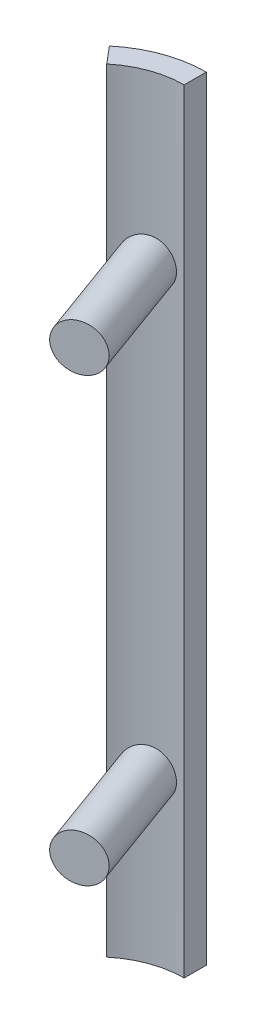
ISO-10303-21;
HEADER;
FILE_DESCRIPTION(('STEP AP214'),'2;1');
FILE_NAME('part.step','',(''),(''),'','','');
FILE_SCHEMA(('AUTOMOTIVE_DESIGN { 1 0 10303 214 1 1 1 1 }'));
ENDSEC;
DATA;
#1=APPLICATION_CONTEXT('core data for automotive mechanical design processes');
#2=APPLICATION_PROTOCOL_DEFINITION('international standard','automotive_design',2000,#1);
#3=PRODUCT_CONTEXT('',#1,'mechanical');
#4=PRODUCT('Part','Part','',(#3));
#5=PRODUCT_RELATED_PRODUCT_CATEGORY('part','',(#4));
#6=PRODUCT_DEFINITION_FORMATION('','',#4);
#7=PRODUCT_DEFINITION_CONTEXT('part definition',#1,'design');
#8=PRODUCT_DEFINITION('design','',#6,#7);
#9=PRODUCT_DEFINITION_SHAPE('','',#8);
#10=(LENGTH_UNIT() NAMED_UNIT(*) SI_UNIT(.MILLI.,.METRE.));
#11=(NAMED_UNIT(*) PLANE_ANGLE_UNIT() SI_UNIT($,.RADIAN.));
#12=(NAMED_UNIT(*) SI_UNIT($,.STERADIAN.) SOLID_ANGLE_UNIT());
#13=UNCERTAINTY_MEASURE_WITH_UNIT(LENGTH_MEASURE(1.E-05),#10,'distance_accuracy_value','');
#14=(GEOMETRIC_REPRESENTATION_CONTEXT(3) GLOBAL_UNCERTAINTY_ASSIGNED_CONTEXT((#13)) GLOBAL_UNIT_ASSIGNED_CONTEXT((#10,
#11,#12)) REPRESENTATION_CONTEXT('',''));
#15=CARTESIAN_POINT('',(0.,0.,0.));
#16=DIRECTION('',(0.,0.,1.));
#17=DIRECTION('',(1.,0.,0.));
#18=AXIS2_PLACEMENT_3D('',#15,#16,#17);
#19=CARTESIAN_POINT('',(0.,0.,0.));
#20=DIRECTION('',(0.,-1.,0.));
#21=DIRECTION('',(0.,0.,-1.));
#22=AXIS2_PLACEMENT_3D('',#19,#20,#21);
#23=PLANE('',#22);
#24=CARTESIAN_POINT('',(0.,0.,0.));
#25=DIRECTION('',(0.,1.,0.));
#26=DIRECTION('',(0.,0.,-1.));
#27=AXIS2_PLACEMENT_3D('',#24,#25,#26);
#28=CIRCLE('',#27,8.);
#29=CARTESIAN_POINT('',(0.,0.,-8.));
#30=VERTEX_POINT('',#29);
#31=CARTESIAN_POINT('',(-5.14230087749233,0.,-6.12835554495182));
#32=VERTEX_POINT('',#31);
#33=EDGE_CURVE('E54',#30,#32,#28,.T.);
#34=ORIENTED_EDGE('',*,*,#33,.T.);
#35=DIRECTION('',(-0.64278760968654,0.,-0.766044443118977));
#36=VECTOR('',#35,1.);
#37=CARTESIAN_POINT('',(0.,0.,0.));
#38=LINE('',#37,#36);
#39=CARTESIAN_POINT('',(-6.42787609686541,0.,-7.66044443118977));
#40=VERTEX_POINT('',#39);
#41=EDGE_CURVE('E90',#32,#40,#38,.T.);
#42=ORIENTED_EDGE('',*,*,#41,.T.);
#43=CARTESIAN_POINT('',(0.,0.,0.));
#44=DIRECTION('',(0.,-1.,0.));
#45=DIRECTION('',(0.,0.,-1.));
#46=AXIS2_PLACEMENT_3D('',#43,#44,#45);
#47=CIRCLE('',#46,10.);
#48=CARTESIAN_POINT('',(0.,0.,-10.));
#49=VERTEX_POINT('',#48);
#50=EDGE_CURVE('E11',#40,#49,#47,.T.);
#51=ORIENTED_EDGE('',*,*,#50,.T.);
#52=DIRECTION('',(0.,0.,-1.));
#53=VECTOR('',#52,1.);
#54=CARTESIAN_POINT('',(0.,0.,0.));
#55=LINE('',#54,#53);
#56=EDGE_CURVE('E92',#30,#49,#55,.T.);
#57=ORIENTED_EDGE('',*,*,#56,.F.);
#58=EDGE_LOOP('',(#34,#42,#51,#57));
#59=FACE_BOUND('',#58,.T.);
#60=ADVANCED_FACE('F39',(#59),#23,.T.);
#61=CARTESIAN_POINT('',(0.,0.,0.));
#62=DIRECTION('',(0.,-1.,0.));
#63=DIRECTION('',(0.,0.,-1.));
#64=AXIS2_PLACEMENT_3D('',#61,#62,#63);
#65=CYLINDRICAL_SURFACE('',#64,10.);
#66=CARTESIAN_POINT('',(0.,70.,0.));
#67=DIRECTION('',(0.,-1.,0.));
#68=DIRECTION('',(0.,0.,-1.));
#69=AXIS2_PLACEMENT_3D('',#66,#67,#68);
#70=CIRCLE('',#69,10.);
#71=CARTESIAN_POINT('',(-6.42787609686541,70.,-7.66044443118977));
#72=VERTEX_POINT('',#71);
#73=CARTESIAN_POINT('',(0.,70.,-10.));
#74=VERTEX_POINT('',#73);
#75=EDGE_CURVE('E47',#72,#74,#70,.T.);
#76=ORIENTED_EDGE('',*,*,#75,.T.);
#77=DIRECTION('',(0.,1.,0.));
#78=VECTOR('',#77,1.);
#79=CARTESIAN_POINT('',(0.,0.,-10.));
#80=LINE('',#79,#78);
#81=EDGE_CURVE('E106',#49,#74,#80,.T.);
#82=ORIENTED_EDGE('',*,*,#81,.F.);
#83=ORIENTED_EDGE('',*,*,#50,.F.);
#84=DIRECTION('',(0.,1.,0.));
#85=VECTOR('',#84,1.);
#86=CARTESIAN_POINT('',(-6.42787609686541,0.,-7.66044443118977));
#87=LINE('',#86,#85);
#88=EDGE_CURVE('E97',#40,#72,#87,.T.);
#89=ORIENTED_EDGE('',*,*,#88,.T.);
#90=EDGE_LOOP('',(#76,#82,#83,#89));
#91=FACE_BOUND('',#90,.T.);
#92=ADVANCED_FACE('F115',(#91),#65,.T.);
#93=CARTESIAN_POINT('',(-6.42787609686541,70.0000000000013,-7.66044443118977));
#94=DIRECTION('',(0.,1.,0.));
#95=DIRECTION('',(0.,0.,1.));
#96=AXIS2_PLACEMENT_3D('',#93,#94,#95);
#97=PLANE('',#96);
#98=CARTESIAN_POINT('',(0.,70.0000000000013,0.));
#99=DIRECTION('',(0.,1.,0.));
#100=DIRECTION('',(0.,0.,-1.));
#101=AXIS2_PLACEMENT_3D('',#98,#99,#100);
#102=CIRCLE('',#101,8.);
#103=CARTESIAN_POINT('',(0.,70.0000000000013,-8.));
#104=VERTEX_POINT('',#103);
#105=CARTESIAN_POINT('',(-5.14230087749233,70.0000000000013,-6.12835554495182));
#106=VERTEX_POINT('',#105);
#107=EDGE_CURVE('E81',#104,#106,#102,.T.);
#108=ORIENTED_EDGE('',*,*,#107,.F.);
#109=DIRECTION('',(0.,2.55351295663786E-13,1.));
#110=VECTOR('',#109,1.);
#111=CARTESIAN_POINT('',(0.,70.,-10.));
#112=LINE('',#111,#110);
#113=EDGE_CURVE('E99',#74,#104,#112,.T.);
#114=ORIENTED_EDGE('',*,*,#113,.F.);
#115=ORIENTED_EDGE('',*,*,#75,.F.);
#116=DIRECTION('',(0.64278760968654,2.55351295663786E-13,0.766044443118977));
#117=VECTOR('',#116,1.);
#118=CARTESIAN_POINT('',(-6.42787609686541,70.,-7.66044443118977));
#119=LINE('',#118,#117);
#120=EDGE_CURVE('E103',#72,#106,#119,.T.);
#121=ORIENTED_EDGE('',*,*,#120,.T.);
#122=EDGE_LOOP('',(#108,#114,#115,#121));
#123=FACE_BOUND('',#122,.T.);
#124=ADVANCED_FACE('F119',(#123),#97,.T.);
#125=CARTESIAN_POINT('',(0.,0.,0.));
#126=DIRECTION('',(0.766044443118977,0.,-0.64278760968654));
#127=DIRECTION('',(-0.64278760968654,0.,-0.766044443118977));
#128=AXIS2_PLACEMENT_3D('',#125,#126,#127);
#129=PLANE('',#128);
#130=ORIENTED_EDGE('',*,*,#41,.F.);
#131=DIRECTION('',(0.,1.,0.));
#132=VECTOR('',#131,1.);
#133=CARTESIAN_POINT('',(-5.14230087749233,0.,-6.12835554495182));
#134=LINE('',#133,#132);
#135=EDGE_CURVE('E78',#32,#106,#134,.T.);
#136=ORIENTED_EDGE('',*,*,#135,.T.);
#137=ORIENTED_EDGE('',*,*,#120,.F.);
#138=ORIENTED_EDGE('',*,*,#88,.F.);
#139=EDGE_LOOP('',(#130,#136,#137,#138));
#140=FACE_BOUND('',#139,.T.);
#141=ADVANCED_FACE('F96',(#140),#129,.F.);
#142=CARTESIAN_POINT('',(0.,0.,0.));
#143=DIRECTION('',(1.,0.,0.));
#144=DIRECTION('',(0.,0.,-1.));
#145=AXIS2_PLACEMENT_3D('',#142,#143,#144);
#146=PLANE('',#145);
#147=DIRECTION('',(0.,1.,0.));
#148=VECTOR('',#147,1.);
#149=CARTESIAN_POINT('',(0.,0.,-8.));
#150=LINE('',#149,#148);
#151=EDGE_CURVE('E86',#30,#104,#150,.T.);
#152=ORIENTED_EDGE('',*,*,#151,.F.);
#153=ORIENTED_EDGE('',*,*,#56,.T.);
#154=ORIENTED_EDGE('',*,*,#81,.T.);
#155=ORIENTED_EDGE('',*,*,#113,.T.);
#156=EDGE_LOOP('',(#152,#153,#154,#155));
#157=FACE_BOUND('',#156,.T.);
#158=ADVANCED_FACE('F117',(#157),#146,.T.);
#159=CARTESIAN_POINT('',(0.,0.,0.));
#160=DIRECTION('',(0.,1.,0.));
#161=DIRECTION('',(0.,0.,1.));
#162=AXIS2_PLACEMENT_3D('',#159,#160,#161);
#163=CYLINDRICAL_SURFACE('',#162,8.);
#164=CARTESIAN_POINT('',(-0.666854923131886,15.,-7.97215808369947));
#165=CARTESIAN_POINT('',(-0.666858379185395,15.1157559635556,-7.97215902622908));
#166=CARTESIAN_POINT('',(-0.676779640821833,15.2315432351994,-7.97134686574616));
#167=CARTESIAN_POINT('',(-0.716053157627041,15.4597786680726,-7.96791336746091));
#168=CARTESIAN_POINT('',(-0.745415556814346,15.5722250540692,-7.96529108514078));
#169=CARTESIAN_POINT('',(-0.822321104053135,15.7904441393774,-7.95771748096725));
#170=CARTESIAN_POINT('',(-0.869839225548843,15.8962257928341,-7.95276936298444));
#171=CARTESIAN_POINT('',(-0.981298510244643,16.0985278602645,-7.93978515425553));
#172=CARTESIAN_POINT('',(-1.04524080330709,16.1950476364614,-7.9317488510461));
#173=CARTESIAN_POINT('',(-1.18898376585009,16.3784260029342,-7.9114907940728));
#174=CARTESIAN_POINT('',(-1.26910094581045,16.4650268496506,-7.899181268638));
#175=CARTESIAN_POINT('',(-1.44172477405649,16.6238325986894,-7.86950364534489));
#176=CARTESIAN_POINT('',(-1.53423267214024,16.6960360469778,-7.85213503699094));
#177=CARTESIAN_POINT('',(-1.73034281972777,16.8250670106849,-7.81127930123956));
#178=CARTESIAN_POINT('',(-1.83409470817184,16.8816390630944,-7.78770157640028));
#179=CARTESIAN_POINT('',(-2.04822819368542,16.9761366058962,-7.73414009574326));
#180=CARTESIAN_POINT('',(-2.15860870546787,17.0140651394527,-7.70415738655219));
#181=CARTESIAN_POINT('',(-2.38000041561791,17.0693670203042,-7.63862704673952));
#182=CARTESIAN_POINT('',(-2.49094303132336,17.0871786187437,-7.60321796019588));
#183=CARTESIAN_POINT('',(-2.71239913293372,17.1031190304944,-7.52705732892853));
#184=CARTESIAN_POINT('',(-2.82291268560432,17.1012510398683,-7.48630665276704));
#185=CARTESIAN_POINT('',(-3.03755089441342,17.0781956002278,-7.40177496312106));
#186=CARTESIAN_POINT('',(-3.14176568875179,17.0574815293303,-7.35809237653706));
#187=CARTESIAN_POINT('',(-3.3439032957963,16.9980856977662,-7.26846216734797));
#188=CARTESIAN_POINT('',(-3.4418257551052,16.9594029289234,-7.22251441777988));
#189=CARTESIAN_POINT('',(-3.62995899058478,16.8647998200186,-7.12983248962596));
#190=CARTESIAN_POINT('',(-3.72008561941032,16.8087156913685,-7.08309500733569));
#191=CARTESIAN_POINT('',(-3.88963352956848,16.6810272156755,-6.99142716860378));
#192=CARTESIAN_POINT('',(-3.96905277600193,16.6094199252367,-6.94649715680049));
#193=CARTESIAN_POINT('',(-4.11781792919618,16.4501985019811,-6.85939032730667));
#194=CARTESIAN_POINT('',(-4.18679353334361,16.3621712808573,-6.81733530393677));
#195=CARTESIAN_POINT('',(-4.31036321065497,16.1739191836195,-6.73988886891115));
#196=CARTESIAN_POINT('',(-4.36495646214648,16.0736936110845,-6.70449783800625));
#197=CARTESIAN_POINT('',(-4.45888588060074,15.8630656711541,-6.64240467126076));
#198=CARTESIAN_POINT('',(-4.49813149013731,15.752607519594,-6.6157542531698));
#199=CARTESIAN_POINT('',(-4.55997396340259,15.5251459418825,-6.57328383264521));
#200=CARTESIAN_POINT('',(-4.58257480924433,15.4081440884658,-6.55746123981398));
#201=CARTESIAN_POINT('',(-4.61014607089664,15.1745524550857,-6.53810606104076));
#202=CARTESIAN_POINT('',(-4.61560873170008,15.0580491117691,-6.53423039272121));
#203=CARTESIAN_POINT('',(-4.61015501579427,14.8256276487339,-6.53807939841161));
#204=CARTESIAN_POINT('',(-4.59924032111941,14.7097094701429,-6.54580288113219));
#205=CARTESIAN_POINT('',(-4.56166907540506,14.4839623289043,-6.57203762932672));
#206=CARTESIAN_POINT('',(-4.53530701102686,14.3740604416247,-6.59034700202695));
#207=CARTESIAN_POINT('',(-4.4676877914174,14.161021003597,-6.63637158577376));
#208=CARTESIAN_POINT('',(-4.4264287360965,14.0578843177243,-6.66408799664738));
#209=CARTESIAN_POINT('',(-4.32883652947519,13.8588688660291,-6.72789957461323));
#210=CARTESIAN_POINT('',(-4.27219990790095,13.7631924589201,-6.76416123497225));
#211=CARTESIAN_POINT('',(-4.14539408044532,13.5839966401116,-6.84260588457614));
#212=CARTESIAN_POINT('',(-4.07522241242899,13.5004794451295,-6.88478995077425));
#213=CARTESIAN_POINT('',(-3.92055265462646,13.3455804491044,-6.97405510387672));
#214=CARTESIAN_POINT('',(-3.83570948732431,13.2746022243574,-7.02123997937088));
#215=CARTESIAN_POINT('',(-3.65494230629775,13.1497472389902,-7.11701082159987));
#216=CARTESIAN_POINT('',(-3.55901888144732,13.0958695701097,-7.16559671377306));
#217=CARTESIAN_POINT('',(-3.35912018810443,13.0072336525762,-7.26143876490062));
#218=CARTESIAN_POINT('',(-3.25521139353975,12.9723337100127,-7.30870220726258));
#219=CARTESIAN_POINT('',(-3.0414832392503,12.9222288445447,-7.40019430844868));
#220=CARTESIAN_POINT('',(-2.93166515102382,12.9070197022957,-7.44442361550305));
#221=CARTESIAN_POINT('',(-2.71265204556567,12.8969856612522,-7.5269388961518));
#222=CARTESIAN_POINT('',(-2.60353566303491,12.901567874017,-7.56536252431463));
#223=CARTESIAN_POINT('',(-2.38596142852058,12.9296146049938,-7.63677281167473));
#224=CARTESIAN_POINT('',(-2.27750355330386,12.9530784530859,-7.66975966377621));
#225=CARTESIAN_POINT('',(-2.06515821757882,13.0178914182188,-7.72963282742268));
#226=CARTESIAN_POINT('',(-1.96124567909149,13.0591235621683,-7.75655731381125));
#227=CARTESIAN_POINT('',(-1.76023021876946,13.1581979400737,-7.8046321377642));
#228=CARTESIAN_POINT('',(-1.66312823081302,13.216042446436,-7.82578168460149));
#229=CARTESIAN_POINT('',(-1.4760956046009,13.34845341906,-7.86323613679428));
#230=CARTESIAN_POINT('',(-1.38641688467834,13.4234153539389,-7.87940087082206));
#231=CARTESIAN_POINT('',(-1.21983252477848,13.5871787103006,-7.90690534767037));
#232=CARTESIAN_POINT('',(-1.14293021882821,13.6759837324792,-7.91824383227485));
#233=CARTESIAN_POINT('',(-1.00291266443092,13.8671695585067,-7.93720825931081));
#234=CARTESIAN_POINT('',(-0.940122945146308,13.9697974963085,-7.94475072447031));
#235=CARTESIAN_POINT('',(-0.832795334423424,14.1843149286737,-7.95671967122338));
#236=CARTESIAN_POINT('',(-0.788245156895644,14.2961981276615,-7.9611482517657));
#237=CARTESIAN_POINT('',(-0.725050512918421,14.5064383672579,-7.9671276737773));
#238=CARTESIAN_POINT('',(-0.703288425001845,14.6038588059361,-7.96903989167317));
#239=CARTESIAN_POINT('',(-0.674189908679482,14.800845257747,-7.9715546217107));
#240=CARTESIAN_POINT('',(-0.666851949766568,14.900411042109,-7.97215727280784));
#241=CARTESIAN_POINT('',(-0.666854923131886,15.,-7.97215808369947));
#242=B_SPLINE_CURVE_WITH_KNOTS('',3,(#164,#165,#166,#167,#168,#169,#170,#171,#172,#173,#174,
#175,#176,#177,#178,#179,#180,#181,#182,#183,#184,#185,#186,#187,#188,#189,#190,#191,#192,#193,
#194,#195,#196,#197,#198,#199,#200,#201,#202,#203,#204,#205,#206,#207,#208,#209,#210,#211,#212,
#213,#214,#215,#216,#217,#218,#219,#220,#221,#222,#223,#224,#225,#226,#227,#228,#229,#230,#231,
#232,#233,#234,#235,#236,#237,#238,#239,#240,#241),.UNSPECIFIED.,.T.,.F.,(4,2,2,2,2,2,2,2,2,2,2,
2,2,2,2,2,2,2,2,2,2,2,2,2,2,2,2,2,2,2,2,2,2,2,2,2,2,2,4),(0.,0.346901812495413,
0.693984774601706,1.04059102006555,1.38722111588192,1.74143920947593,2.09569305845791,
2.4554336017461,2.8151154054019,3.1668004797452,3.51842843956863,3.86146089514392,
4.20451259968873,4.55089656276603,4.8973462623431,5.25411055949777,5.61089523439251,
5.96975442024494,6.32852772428484,6.67689726569673,7.02523103030444,7.36713083024467,
7.70907425442382,8.05832960560822,8.40764854919867,8.76671324559398,9.1257588678248,
9.48208558579403,9.83833593743036,10.1839893363923,10.5296304684601,10.8730301112332,
11.2164767500635,11.5688480068,11.9213110714784,12.2812190642817,12.6408842239052,
12.9393678205879,13.237819744236),.UNSPECIFIED.);
#243=CARTESIAN_POINT('',(-0.666854923131886,15.,-7.97215808369947));
#244=VERTEX_POINT('',#243);
#245=EDGE_CURVE('E214',#244,#244,#242,.T.);
#246=ORIENTED_EDGE('',*,*,#245,.F.);
#247=EDGE_LOOP('',(#246));
#248=FACE_BOUND('',#247,.T.);
#249=CARTESIAN_POINT('',(-0.66685492313189,55.,-7.97215808369947));
#250=CARTESIAN_POINT('',(-0.666858379185399,55.1157559635556,-7.97215902622908));
#251=CARTESIAN_POINT('',(-0.676779640821836,55.2315432351994,-7.97134686574616));
#252=CARTESIAN_POINT('',(-0.716053157627042,55.4597786680726,-7.96791336746091));
#253=CARTESIAN_POINT('',(-0.745415556814347,55.5722250540692,-7.96529108514078));
#254=CARTESIAN_POINT('',(-0.822321104053134,55.7904441393773,-7.95771748096725));
#255=CARTESIAN_POINT('',(-0.86983922554884,55.896225792834,-7.95276936298444));
#256=CARTESIAN_POINT('',(-0.981298510244637,56.0985278602645,-7.93978515425553));
#257=CARTESIAN_POINT('',(-1.04524080330708,56.1950476364614,-7.9317488510461));
#258=CARTESIAN_POINT('',(-1.18898376585008,56.3784260029341,-7.91149079407281));
#259=CARTESIAN_POINT('',(-1.26910094581044,56.4650268496505,-7.899181268638));
#260=CARTESIAN_POINT('',(-1.44172477405648,56.6238325986893,-7.86950364534489));
#261=CARTESIAN_POINT('',(-1.53423267214023,56.6960360469778,-7.85213503699094));
#262=CARTESIAN_POINT('',(-1.73034281972776,56.8250670106849,-7.81127930123957));
#263=CARTESIAN_POINT('',(-1.83409470817183,56.8816390630944,-7.78770157640028));
#264=CARTESIAN_POINT('',(-2.04822819368541,56.9761366058961,-7.73414009574326));
#265=CARTESIAN_POINT('',(-2.15860870546787,57.0140651394527,-7.70415738655219));
#266=CARTESIAN_POINT('',(-2.38000041561791,57.0693670203041,-7.63862704673953));
#267=CARTESIAN_POINT('',(-2.49094303132335,57.0871786187437,-7.60321796019589));
#268=CARTESIAN_POINT('',(-2.71239913293371,57.1031190304944,-7.52705732892853));
#269=CARTESIAN_POINT('',(-2.82291268560431,57.1012510398683,-7.48630665276705));
#270=CARTESIAN_POINT('',(-3.03755089441341,57.0781956002278,-7.40177496312106));
#271=CARTESIAN_POINT('',(-3.14176568875178,57.0574815293303,-7.35809237653706));
#272=CARTESIAN_POINT('',(-3.34390329579629,56.9980856977662,-7.26846216734797));
#273=CARTESIAN_POINT('',(-3.44182575510519,56.9594029289234,-7.22251441777989));
#274=CARTESIAN_POINT('',(-3.62995899058478,56.8647998200186,-7.12983248962596));
#275=CARTESIAN_POINT('',(-3.72008561941031,56.8087156913685,-7.08309500733569));
#276=CARTESIAN_POINT('',(-3.88963352956848,56.6810272156755,-6.99142716860378));
#277=CARTESIAN_POINT('',(-3.96905277600193,56.6094199252366,-6.94649715680049));
#278=CARTESIAN_POINT('',(-4.11781792919617,56.4501985019811,-6.85939032730667));
#279=CARTESIAN_POINT('',(-4.1867935333436,56.3621712808573,-6.81733530393677));
#280=CARTESIAN_POINT('',(-4.31036321065496,56.1739191836196,-6.73988886891116));
#281=CARTESIAN_POINT('',(-4.36495646214647,56.0736936110845,-6.70449783800625));
#282=CARTESIAN_POINT('',(-4.45888588060073,55.8630656711541,-6.64240467126077));
#283=CARTESIAN_POINT('',(-4.49813149013731,55.752607519594,-6.6157542531698));
#284=CARTESIAN_POINT('',(-4.55997396340258,55.5251459418825,-6.57328383264521));
#285=CARTESIAN_POINT('',(-4.58257480924433,55.4081440884658,-6.55746123981398));
#286=CARTESIAN_POINT('',(-4.61014607089664,55.1745524550857,-6.53810606104077));
#287=CARTESIAN_POINT('',(-4.61560873170008,55.0580491117691,-6.53423039272121));
#288=CARTESIAN_POINT('',(-4.61015501579427,54.8256276487339,-6.53807939841161));
#289=CARTESIAN_POINT('',(-4.59924032111941,54.7097094701429,-6.54580288113219));
#290=CARTESIAN_POINT('',(-4.56166907540506,54.4839623289043,-6.57203762932672));
#291=CARTESIAN_POINT('',(-4.53530701102686,54.3740604416247,-6.59034700202695));
#292=CARTESIAN_POINT('',(-4.46768779141741,54.161021003597,-6.63637158577376));
#293=CARTESIAN_POINT('',(-4.4264287360965,54.0578843177244,-6.66408799664738));
#294=CARTESIAN_POINT('',(-4.3288365294752,53.8588688660292,-6.72789957461322));
#295=CARTESIAN_POINT('',(-4.27219990790095,53.7631924589201,-6.76416123497224));
#296=CARTESIAN_POINT('',(-4.14539408044533,53.5839966401116,-6.84260588457613));
#297=CARTESIAN_POINT('',(-4.075222412429,53.5004794451295,-6.88478995077424));
#298=CARTESIAN_POINT('',(-3.92055265462647,53.3455804491044,-6.97405510387672));
#299=CARTESIAN_POINT('',(-3.83570948732432,53.2746022243574,-7.02123997937088));
#300=CARTESIAN_POINT('',(-3.65494230629776,53.1497472389902,-7.11701082159987));
#301=CARTESIAN_POINT('',(-3.55901888144733,53.0958695701097,-7.16559671377306));
#302=CARTESIAN_POINT('',(-3.35912018810444,53.0072336525762,-7.26143876490062));
#303=CARTESIAN_POINT('',(-3.25521139353976,52.9723337100127,-7.30870220726258));
#304=CARTESIAN_POINT('',(-3.04148323925031,52.9222288445447,-7.40019430844867));
#305=CARTESIAN_POINT('',(-2.93166515102383,52.9070197022957,-7.44442361550305));
#306=CARTESIAN_POINT('',(-2.71265204556567,52.8969856612522,-7.5269388961518));
#307=CARTESIAN_POINT('',(-2.60353566303491,52.901567874017,-7.56536252431463));
#308=CARTESIAN_POINT('',(-2.38596142852059,52.9296146049938,-7.63677281167473));
#309=CARTESIAN_POINT('',(-2.27750355330387,52.9530784530859,-7.66975966377621));
#310=CARTESIAN_POINT('',(-2.06515821757883,53.0178914182188,-7.72963282742268));
#311=CARTESIAN_POINT('',(-1.9612456790915,53.0591235621683,-7.75655731381125));
#312=CARTESIAN_POINT('',(-1.76023021876947,53.1581979400737,-7.8046321377642));
#313=CARTESIAN_POINT('',(-1.66312823081303,53.216042446436,-7.82578168460149));
#314=CARTESIAN_POINT('',(-1.47609560460091,53.34845341906,-7.86323613679428));
#315=CARTESIAN_POINT('',(-1.38641688467835,53.4234153539389,-7.87940087082206));
#316=CARTESIAN_POINT('',(-1.21983252477849,53.5871787103006,-7.90690534767037));
#317=CARTESIAN_POINT('',(-1.14293021882822,53.6759837324792,-7.91824383227485));
#318=CARTESIAN_POINT('',(-1.00291266443093,53.8671695585067,-7.93720825931081));
#319=CARTESIAN_POINT('',(-0.940122945146317,53.9697974963085,-7.94475072447031));
#320=CARTESIAN_POINT('',(-0.832795334423433,54.1843149286737,-7.95671967122338));
#321=CARTESIAN_POINT('',(-0.788245156895651,54.2961981276614,-7.9611482517657));
#322=CARTESIAN_POINT('',(-0.725050512918426,54.5064383672579,-7.9671276737773));
#323=CARTESIAN_POINT('',(-0.70328842500185,54.6038588059361,-7.96903989167317));
#324=CARTESIAN_POINT('',(-0.674189908679486,54.800845257747,-7.9715546217107));
#325=CARTESIAN_POINT('',(-0.666851949766572,54.900411042109,-7.97215727280784));
#326=CARTESIAN_POINT('',(-0.66685492313189,55.,-7.97215808369947));
#327=B_SPLINE_CURVE_WITH_KNOTS('',3,(#249,#250,#251,#252,#253,#254,#255,#256,#257,#258,#259,
#260,#261,#262,#263,#264,#265,#266,#267,#268,#269,#270,#271,#272,#273,#274,#275,#276,#277,#278,
#279,#280,#281,#282,#283,#284,#285,#286,#287,#288,#289,#290,#291,#292,#293,#294,#295,#296,#297,
#298,#299,#300,#301,#302,#303,#304,#305,#306,#307,#308,#309,#310,#311,#312,#313,#314,#315,#316,
#317,#318,#319,#320,#321,#322,#323,#324,#325,#326),.UNSPECIFIED.,.T.,.F.,(4,2,2,2,2,2,2,2,2,2,2,
2,2,2,2,2,2,2,2,2,2,2,2,2,2,2,2,2,2,2,2,2,2,2,2,2,2,2,4),(0.,0.34690181249541,0.693984774601699,
1.04059102006553,1.38722111588191,1.74143920947591,2.09569305845789,2.45543360174608,
2.81511540540189,3.16680047974519,3.51842843956861,3.86146089514391,4.20451259968872,
4.55089656276602,4.89734626234309,5.25411055949776,5.61089523439249,5.96975442024493,
6.32852772428483,6.67689726569671,7.02523103030442,7.36713083024464,7.7090742544238,
8.05832960560819,8.40764854919864,8.76671324559395,9.12575886782478,9.48208558579401,
9.83833593743034,10.1839893363923,10.52963046846,10.8730301112332,11.2164767500635,
11.5688480068,11.9213110714784,12.2812190642816,12.6408842239052,12.9393678205879,
13.237819744236),.UNSPECIFIED.);
#328=CARTESIAN_POINT('',(-0.66685492313189,55.,-7.97215808369947));
#329=VERTEX_POINT('',#328);
#330=EDGE_CURVE('E121',#329,#329,#327,.T.);
#331=ORIENTED_EDGE('',*,*,#330,.F.);
#332=EDGE_LOOP('',(#331));
#333=FACE_BOUND('',#332,.T.);
#334=ORIENTED_EDGE('',*,*,#107,.T.);
#335=ORIENTED_EDGE('',*,*,#135,.F.);
#336=ORIENTED_EDGE('',*,*,#33,.F.);
#337=ORIENTED_EDGE('',*,*,#151,.T.);
#338=EDGE_LOOP('',(#334,#335,#336,#337));
#339=FACE_BOUND('',#338,.T.);
#340=ADVANCED_FACE('F79',(#248,#333,#339),#163,.F.);
#341=CARTESIAN_POINT('',(0.849050994510532,55.,2.33274843538317));
#342=DIRECTION('',(0.34202014332567,0.,0.939692620785908));
#343=DIRECTION('',(0.939692620785908,0.,-0.34202014332567));
#344=AXIS2_PLACEMENT_3D('',#341,#342,#343);
#345=PLANE('',#344);
#346=CARTESIAN_POINT('',(0.849050994510532,55.,2.33274843538317));
#347=DIRECTION('',(0.34202014332567,0.,0.939692620785908));
#348=DIRECTION('',(0.939692620785908,0.,-0.34202014332567));
#349=AXIS2_PLACEMENT_3D('',#346,#347,#348);
#350=CIRCLE('',#349,2.1);
#351=CARTESIAN_POINT('',(2.82240549816094,55.,1.61450613439926));
#352=VERTEX_POINT('',#351);
#353=EDGE_CURVE('E125',#352,#352,#350,.T.);
#354=ORIENTED_EDGE('',*,*,#353,.T.);
#355=EDGE_LOOP('',(#354));
#356=FACE_BOUND('',#355,.T.);
#357=ADVANCED_FACE('F147',(#356),#345,.T.);
#358=CARTESIAN_POINT('',(-3.96629508591817,55.,-10.897306187454));
#359=DIRECTION('',(0.34202014332567,0.,0.939692620785908));
#360=DIRECTION('',(0.939692620785908,0.,-0.34202014332567));
#361=AXIS2_PLACEMENT_3D('',#358,#359,#360);
#362=CYLINDRICAL_SURFACE('',#361,2.1);
#363=ORIENTED_EDGE('',*,*,#353,.F.);
#364=EDGE_LOOP('',(#363));
#365=FACE_BOUND('',#364,.T.);
#366=ORIENTED_EDGE('',*,*,#330,.T.);
#367=EDGE_LOOP('',(#366));
#368=FACE_BOUND('',#367,.T.);
#369=ADVANCED_FACE('F138',(#365,#368),#362,.T.);
#370=CARTESIAN_POINT('',(0.849050994510531,15.,2.33274843538317));
#371=DIRECTION('',(0.34202014332567,0.,0.939692620785908));
#372=DIRECTION('',(0.939692620785908,0.,-0.34202014332567));
#373=AXIS2_PLACEMENT_3D('',#370,#371,#372);
#374=PLANE('',#373);
#375=CARTESIAN_POINT('',(0.849050994510531,15.,2.33274843538317));
#376=DIRECTION('',(0.34202014332567,0.,0.939692620785908));
#377=DIRECTION('',(0.939692620785908,0.,-0.34202014332567));
#378=AXIS2_PLACEMENT_3D('',#375,#376,#377);
#379=CIRCLE('',#378,2.1);
#380=CARTESIAN_POINT('',(2.82240549816094,15.,1.61450613439926));
#381=VERTEX_POINT('',#380);
#382=EDGE_CURVE('E211',#381,#381,#379,.T.);
#383=ORIENTED_EDGE('',*,*,#382,.T.);
#384=EDGE_LOOP('',(#383));
#385=FACE_BOUND('',#384,.T.);
#386=ADVANCED_FACE('F154',(#385),#374,.T.);
#387=CARTESIAN_POINT('',(-3.96629508591817,15.,-10.897306187454));
#388=DIRECTION('',(0.34202014332567,0.,0.939692620785908));
#389=DIRECTION('',(0.939692620785908,0.,-0.34202014332567));
#390=AXIS2_PLACEMENT_3D('',#387,#388,#389);
#391=CYLINDRICAL_SURFACE('',#390,2.1);
#392=ORIENTED_EDGE('',*,*,#382,.F.);
#393=EDGE_LOOP('',(#392));
#394=FACE_BOUND('',#393,.T.);
#395=ORIENTED_EDGE('',*,*,#245,.T.);
#396=EDGE_LOOP('',(#395));
#397=FACE_BOUND('',#396,.T.);
#398=ADVANCED_FACE('F144',(#394,#397),#391,.T.);
#399=CLOSED_SHELL('',(#60,#92,#124,#141,#158,#340,#357,#369,#386,#398));
#400=MANIFOLD_SOLID_BREP('B2',#399);
#401=ADVANCED_BREP_SHAPE_REPRESENTATION('',(#18,#400),#14);
#402=SHAPE_DEFINITION_REPRESENTATION(#9,#401);
ENDSEC;
END-ISO-10303-21;
